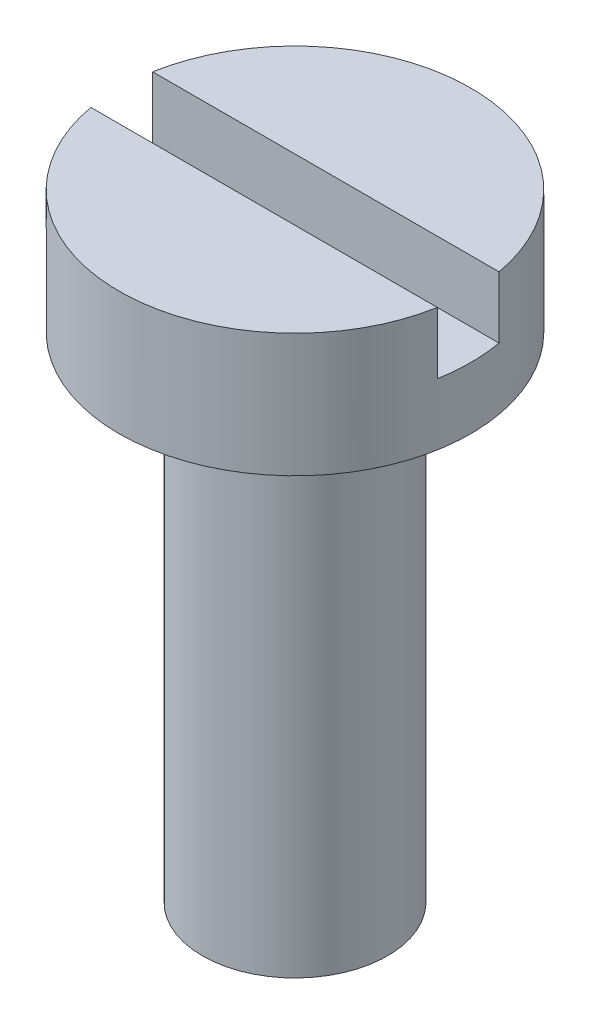
ISO-10303-21;
HEADER;
FILE_DESCRIPTION(('STEP AP214'),'2;1');
FILE_NAME('part.step','',(''),(''),'','','');
FILE_SCHEMA(('AUTOMOTIVE_DESIGN { 1 0 10303 214 1 1 1 1 }'));
ENDSEC;
DATA;
#1=APPLICATION_CONTEXT('core data for automotive mechanical design processes');
#2=APPLICATION_PROTOCOL_DEFINITION('international standard','automotive_design',2000,#1);
#3=PRODUCT_CONTEXT('',#1,'mechanical');
#4=PRODUCT('Part','Part','',(#3));
#5=PRODUCT_RELATED_PRODUCT_CATEGORY('part','',(#4));
#6=PRODUCT_DEFINITION_FORMATION('','',#4);
#7=PRODUCT_DEFINITION_CONTEXT('part definition',#1,'design');
#8=PRODUCT_DEFINITION('design','',#6,#7);
#9=PRODUCT_DEFINITION_SHAPE('','',#8);
#10=(LENGTH_UNIT() NAMED_UNIT(*) SI_UNIT(.MILLI.,.METRE.));
#11=(NAMED_UNIT(*) PLANE_ANGLE_UNIT() SI_UNIT($,.RADIAN.));
#12=(NAMED_UNIT(*) SI_UNIT($,.STERADIAN.) SOLID_ANGLE_UNIT());
#13=UNCERTAINTY_MEASURE_WITH_UNIT(LENGTH_MEASURE(1.E-05),#10,'distance_accuracy_value','');
#14=(GEOMETRIC_REPRESENTATION_CONTEXT(3) GLOBAL_UNCERTAINTY_ASSIGNED_CONTEXT((#13)) GLOBAL_UNIT_ASSIGNED_CONTEXT((#10,
#11,#12)) REPRESENTATION_CONTEXT('',''));
#15=CARTESIAN_POINT('',(0.,0.,0.));
#16=DIRECTION('',(0.,0.,1.));
#17=DIRECTION('',(1.,0.,0.));
#18=AXIS2_PLACEMENT_3D('',#15,#16,#17);
#19=CARTESIAN_POINT('',(0.,2.,0.));
#20=DIRECTION('',(0.,1.,0.));
#21=DIRECTION('',(0.,0.,1.));
#22=AXIS2_PLACEMENT_3D('',#19,#20,#21);
#23=PLANE('',#22);
#24=DIRECTION('',(1.,0.,0.));
#25=VECTOR('',#24,1.);
#26=CARTESIAN_POINT('',(0.,2.,0.5));
#27=LINE('',#26,#25);
#28=CARTESIAN_POINT('',(-2.80579756931964,2.,0.5));
#29=VERTEX_POINT('',#28);
#30=CARTESIAN_POINT('',(2.80579756931964,2.,0.5));
#31=VERTEX_POINT('',#30);
#32=EDGE_CURVE('E83',#29,#31,#27,.T.);
#33=ORIENTED_EDGE('',*,*,#32,.F.);
#34=CARTESIAN_POINT('',(0.,2.,0.));
#35=DIRECTION('',(0.,1.,0.));
#36=DIRECTION('',(0.,0.,1.));
#37=AXIS2_PLACEMENT_3D('',#34,#35,#36);
#38=CIRCLE('',#37,2.85);
#39=EDGE_CURVE('E93',#29,#31,#38,.T.);
#40=ORIENTED_EDGE('',*,*,#39,.T.);
#41=EDGE_LOOP('',(#33,#40));
#42=FACE_BOUND('',#41,.T.);
#43=ADVANCED_FACE('F35',(#42),#23,.T.);
#44=CARTESIAN_POINT('',(0.,2.,0.));
#45=DIRECTION('',(0.,-1.,0.));
#46=DIRECTION('',(0.,0.,-1.));
#47=AXIS2_PLACEMENT_3D('',#44,#45,#46);
#48=CYLINDRICAL_SURFACE('',#47,2.85);
#49=CARTESIAN_POINT('',(0.,1.,0.));
#50=DIRECTION('',(0.,-1.,0.));
#51=DIRECTION('',(0.,0.,-1.));
#52=AXIS2_PLACEMENT_3D('',#49,#50,#51);
#53=CIRCLE('',#52,2.85);
#54=CARTESIAN_POINT('',(2.80579756931964,1.,-0.5));
#55=VERTEX_POINT('',#54);
#56=CARTESIAN_POINT('',(2.80579756931964,1.,0.5));
#57=VERTEX_POINT('',#56);
#58=EDGE_CURVE('E11',#55,#57,#53,.T.);
#59=ORIENTED_EDGE('',*,*,#58,.T.);
#60=DIRECTION('',(0.,-1.,0.));
#61=VECTOR('',#60,1.);
#62=CARTESIAN_POINT('',(2.80579756931964,2.,0.5));
#63=LINE('',#62,#61);
#64=EDGE_CURVE('E58',#57,#31,#63,.F.);
#65=ORIENTED_EDGE('',*,*,#64,.T.);
#66=ORIENTED_EDGE('',*,*,#39,.F.);
#67=DIRECTION('',(0.,-1.,0.));
#68=VECTOR('',#67,1.);
#69=CARTESIAN_POINT('',(-2.80579756931964,2.,0.5));
#70=LINE('',#69,#68);
#71=CARTESIAN_POINT('',(-2.80579756931964,1.,0.5));
#72=VERTEX_POINT('',#71);
#73=EDGE_CURVE('E105',#29,#72,#70,.T.);
#74=ORIENTED_EDGE('',*,*,#73,.T.);
#75=CARTESIAN_POINT('',(-2.80579756931964,1.,-0.5));
#76=VERTEX_POINT('',#75);
#77=EDGE_CURVE('E39',#72,#76,#53,.T.);
#78=ORIENTED_EDGE('',*,*,#77,.T.);
#79=DIRECTION('',(0.,-1.,0.));
#80=VECTOR('',#79,1.);
#81=CARTESIAN_POINT('',(-2.80579756931964,2.,-0.5));
#82=LINE('',#81,#80);
#83=CARTESIAN_POINT('',(-2.80579756931964,2.,-0.5));
#84=VERTEX_POINT('',#83);
#85=EDGE_CURVE('E78',#76,#84,#82,.F.);
#86=ORIENTED_EDGE('',*,*,#85,.T.);
#87=CARTESIAN_POINT('',(2.80579756931964,2.,-0.5));
#88=VERTEX_POINT('',#87);
#89=EDGE_CURVE('E84',#88,#84,#38,.T.);
#90=ORIENTED_EDGE('',*,*,#89,.F.);
#91=DIRECTION('',(0.,-1.,0.));
#92=VECTOR('',#91,1.);
#93=CARTESIAN_POINT('',(2.80579756931964,2.,-0.5));
#94=LINE('',#93,#92);
#95=EDGE_CURVE('E50',#88,#55,#94,.T.);
#96=ORIENTED_EDGE('',*,*,#95,.T.);
#97=EDGE_LOOP('',(#59,#65,#66,#74,#78,#86,#90,#96));
#98=FACE_BOUND('',#97,.T.);
#99=CARTESIAN_POINT('',(0.,0.,0.));
#100=DIRECTION('',(0.,1.,0.));
#101=DIRECTION('',(0.,0.,1.));
#102=AXIS2_PLACEMENT_3D('',#99,#100,#101);
#103=CIRCLE('',#102,2.85);
#104=CARTESIAN_POINT('',(0.,0.,2.85));
#105=VERTEX_POINT('',#104);
#106=EDGE_CURVE('E96',#105,#105,#103,.T.);
#107=ORIENTED_EDGE('',*,*,#106,.T.);
#108=EDGE_LOOP('',(#107));
#109=FACE_BOUND('',#108,.T.);
#110=ADVANCED_FACE('F37',(#98,#109),#48,.T.);
#111=DIRECTION('',(-1.,0.,0.));
#112=VECTOR('',#111,1.);
#113=CARTESIAN_POINT('',(0.,2.,-0.5));
#114=LINE('',#113,#112);
#115=EDGE_CURVE('E75',#88,#84,#114,.T.);
#116=ORIENTED_EDGE('',*,*,#115,.F.);
#117=ORIENTED_EDGE('',*,*,#89,.T.);
#118=EDGE_LOOP('',(#116,#117));
#119=FACE_BOUND('',#118,.T.);
#120=ADVANCED_FACE('F92',(#119),#23,.T.);
#121=CARTESIAN_POINT('',(0.,0.,0.));
#122=DIRECTION('',(0.,1.,0.));
#123=DIRECTION('',(0.,0.,1.));
#124=AXIS2_PLACEMENT_3D('',#121,#122,#123);
#125=PLANE('',#124);
#126=CARTESIAN_POINT('',(0.,0.,0.));
#127=DIRECTION('',(0.,1.,0.));
#128=DIRECTION('',(0.,0.,1.));
#129=AXIS2_PLACEMENT_3D('',#126,#127,#128);
#130=CIRCLE('',#129,1.5);
#131=CARTESIAN_POINT('',(0.,0.,1.5));
#132=VERTEX_POINT('',#131);
#133=EDGE_CURVE('E99',#132,#132,#130,.T.);
#134=ORIENTED_EDGE('',*,*,#133,.T.);
#135=EDGE_LOOP('',(#134));
#136=FACE_BOUND('',#135,.T.);
#137=ORIENTED_EDGE('',*,*,#106,.F.);
#138=EDGE_LOOP('',(#137));
#139=FACE_BOUND('',#138,.T.);
#140=ADVANCED_FACE('F116',(#136,#139),#125,.F.);
#141=CARTESIAN_POINT('',(0.,-8.,0.));
#142=DIRECTION('',(0.,1.,0.));
#143=DIRECTION('',(0.,0.,1.));
#144=AXIS2_PLACEMENT_3D('',#141,#142,#143);
#145=CYLINDRICAL_SURFACE('',#144,1.5);
#146=CARTESIAN_POINT('',(0.,-8.,0.));
#147=DIRECTION('',(0.,1.,0.));
#148=DIRECTION('',(0.,0.,1.));
#149=AXIS2_PLACEMENT_3D('',#146,#147,#148);
#150=CIRCLE('',#149,1.5);
#151=CARTESIAN_POINT('',(0.,-8.,1.5));
#152=VERTEX_POINT('',#151);
#153=EDGE_CURVE('E102',#152,#152,#150,.T.);
#154=ORIENTED_EDGE('',*,*,#153,.T.);
#155=EDGE_LOOP('',(#154));
#156=FACE_BOUND('',#155,.T.);
#157=ORIENTED_EDGE('',*,*,#133,.F.);
#158=EDGE_LOOP('',(#157));
#159=FACE_BOUND('',#158,.T.);
#160=ADVANCED_FACE('F120',(#156,#159),#145,.T.);
#161=CARTESIAN_POINT('',(0.,-8.,0.));
#162=DIRECTION('',(0.,1.,0.));
#163=DIRECTION('',(0.,0.,1.));
#164=AXIS2_PLACEMENT_3D('',#161,#162,#163);
#165=PLANE('',#164);
#166=ORIENTED_EDGE('',*,*,#153,.F.);
#167=EDGE_LOOP('',(#166));
#168=FACE_BOUND('',#167,.T.);
#169=ADVANCED_FACE('F125',(#168),#165,.F.);
#170=CARTESIAN_POINT('',(0.,1.,0.));
#171=DIRECTION('',(0.,-1.,0.));
#172=DIRECTION('',(0.,0.,-1.));
#173=AXIS2_PLACEMENT_3D('',#170,#171,#172);
#174=PLANE('',#173);
#175=DIRECTION('',(-1.,0.,0.));
#176=VECTOR('',#175,1.);
#177=CARTESIAN_POINT('',(-3.,1.,-0.5));
#178=LINE('',#177,#176);
#179=EDGE_CURVE('E137',#55,#76,#178,.T.);
#180=ORIENTED_EDGE('',*,*,#179,.T.);
#181=ORIENTED_EDGE('',*,*,#77,.F.);
#182=DIRECTION('',(1.,0.,0.));
#183=VECTOR('',#182,1.);
#184=CARTESIAN_POINT('',(-3.,1.,0.5));
#185=LINE('',#184,#183);
#186=EDGE_CURVE('E90',#72,#57,#185,.T.);
#187=ORIENTED_EDGE('',*,*,#186,.T.);
#188=ORIENTED_EDGE('',*,*,#58,.F.);
#189=EDGE_LOOP('',(#180,#181,#187,#188));
#190=FACE_BOUND('',#189,.T.);
#191=ADVANCED_FACE('F139',(#190),#174,.F.);
#192=CARTESIAN_POINT('',(-3.,1.,0.5));
#193=DIRECTION('',(0.,0.,1.));
#194=DIRECTION('',(1.,0.,0.));
#195=AXIS2_PLACEMENT_3D('',#192,#193,#194);
#196=PLANE('',#195);
#197=ORIENTED_EDGE('',*,*,#32,.T.);
#198=ORIENTED_EDGE('',*,*,#64,.F.);
#199=ORIENTED_EDGE('',*,*,#186,.F.);
#200=ORIENTED_EDGE('',*,*,#73,.F.);
#201=EDGE_LOOP('',(#197,#198,#199,#200));
#202=FACE_BOUND('',#201,.T.);
#203=ADVANCED_FACE('F104',(#202),#196,.F.);
#204=CARTESIAN_POINT('',(-3.,1.,-0.5));
#205=DIRECTION('',(0.,0.,-1.));
#206=DIRECTION('',(-1.,0.,0.));
#207=AXIS2_PLACEMENT_3D('',#204,#205,#206);
#208=PLANE('',#207);
#209=ORIENTED_EDGE('',*,*,#115,.T.);
#210=ORIENTED_EDGE('',*,*,#85,.F.);
#211=ORIENTED_EDGE('',*,*,#179,.F.);
#212=ORIENTED_EDGE('',*,*,#95,.F.);
#213=EDGE_LOOP('',(#209,#210,#211,#212));
#214=FACE_BOUND('',#213,.T.);
#215=ADVANCED_FACE('F77',(#214),#208,.F.);
#216=CLOSED_SHELL('',(#43,#110,#120,#140,#160,#169,#191,#203,#215));
#217=MANIFOLD_SOLID_BREP('B2',#216);
#218=ADVANCED_BREP_SHAPE_REPRESENTATION('',(#18,#217),#14);
#219=SHAPE_DEFINITION_REPRESENTATION(#9,#218);
ENDSEC;
END-ISO-10303-21;
